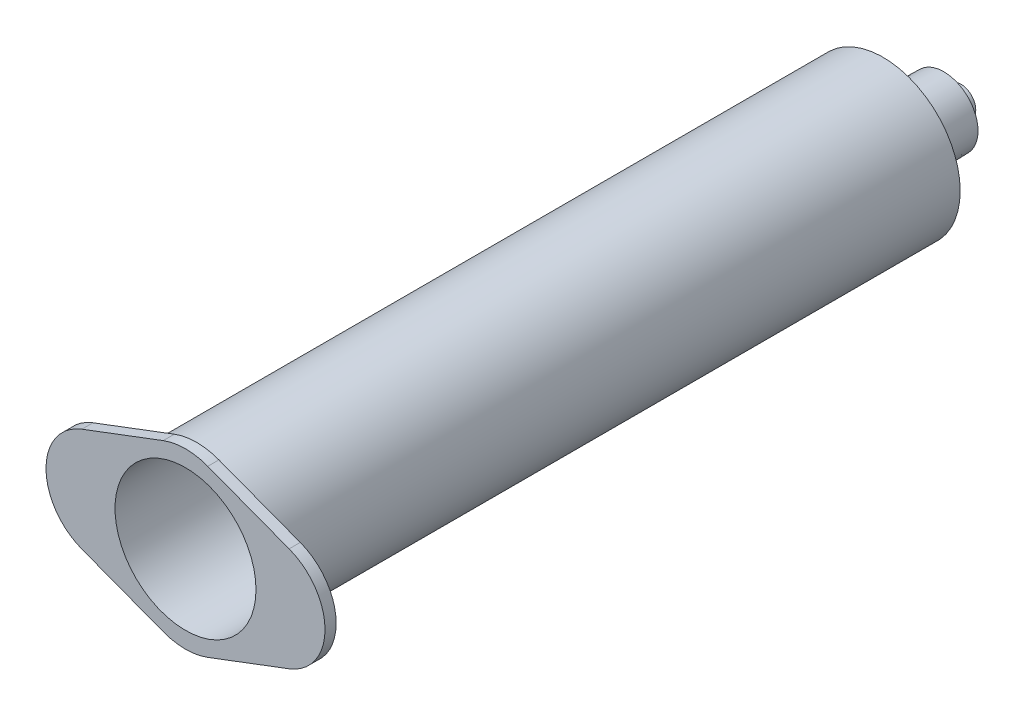
ISO-10303-21;
HEADER;
FILE_DESCRIPTION(('STEP AP214'),'2;1');
FILE_NAME('part.step','',(''),(''),'','','');
FILE_SCHEMA(('AUTOMOTIVE_DESIGN { 1 0 10303 214 1 1 1 1 }'));
ENDSEC;
DATA;
#1=APPLICATION_CONTEXT('core data for automotive mechanical design processes');
#2=APPLICATION_PROTOCOL_DEFINITION('international standard','automotive_design',2000,#1);
#3=PRODUCT_CONTEXT('',#1,'mechanical');
#4=PRODUCT('Part','Part','',(#3));
#5=PRODUCT_RELATED_PRODUCT_CATEGORY('part','',(#4));
#6=PRODUCT_DEFINITION_FORMATION('','',#4);
#7=PRODUCT_DEFINITION_CONTEXT('part definition',#1,'design');
#8=PRODUCT_DEFINITION('design','',#6,#7);
#9=PRODUCT_DEFINITION_SHAPE('','',#8);
#10=(LENGTH_UNIT() NAMED_UNIT(*) SI_UNIT(.MILLI.,.METRE.));
#11=(NAMED_UNIT(*) PLANE_ANGLE_UNIT() SI_UNIT($,.RADIAN.));
#12=(NAMED_UNIT(*) SI_UNIT($,.STERADIAN.) SOLID_ANGLE_UNIT());
#13=UNCERTAINTY_MEASURE_WITH_UNIT(LENGTH_MEASURE(1.E-05),#10,'distance_accuracy_value','');
#14=(GEOMETRIC_REPRESENTATION_CONTEXT(3) GLOBAL_UNCERTAINTY_ASSIGNED_CONTEXT((#13)) GLOBAL_UNIT_ASSIGNED_CONTEXT((#10,
#11,#12)) REPRESENTATION_CONTEXT('',''));
#15=CARTESIAN_POINT('',(0.,0.,0.));
#16=DIRECTION('',(0.,0.,1.));
#17=DIRECTION('',(1.,0.,0.));
#18=AXIS2_PLACEMENT_3D('',#15,#16,#17);
#19=CARTESIAN_POINT('',(0.,0.,92.5));
#20=DIRECTION('',(0.,0.,-1.));
#21=DIRECTION('',(-1.,0.,0.));
#22=AXIS2_PLACEMENT_3D('',#19,#20,#21);
#23=CYLINDRICAL_SURFACE('',#22,10.4);
#24=CARTESIAN_POINT('',(0.,0.,92.5));
#25=DIRECTION('',(0.,0.,1.));
#26=DIRECTION('',(1.,0.,0.));
#27=AXIS2_PLACEMENT_3D('',#24,#25,#26);
#28=CIRCLE('',#27,10.4);
#29=CARTESIAN_POINT('',(10.4,0.,92.5));
#30=VERTEX_POINT('',#29);
#31=EDGE_CURVE('E11',#30,#30,#28,.T.);
#32=ORIENTED_EDGE('',*,*,#31,.F.);
#33=EDGE_LOOP('',(#32));
#34=FACE_BOUND('',#33,.T.);
#35=CARTESIAN_POINT('',(0.,0.,0.));
#36=DIRECTION('',(0.,0.,1.));
#37=DIRECTION('',(1.,0.,0.));
#38=AXIS2_PLACEMENT_3D('',#35,#36,#37);
#39=CIRCLE('',#38,10.4);
#40=CARTESIAN_POINT('',(10.4,0.,0.));
#41=VERTEX_POINT('',#40);
#42=EDGE_CURVE('E165',#41,#41,#39,.T.);
#43=ORIENTED_EDGE('',*,*,#42,.T.);
#44=EDGE_LOOP('',(#43));
#45=FACE_BOUND('',#44,.T.);
#46=ADVANCED_FACE('F37',(#34,#45),#23,.T.);
#47=CARTESIAN_POINT('',(0.,0.,92.5));
#48=DIRECTION('',(0.,0.,-1.));
#49=DIRECTION('',(-1.,0.,0.));
#50=AXIS2_PLACEMENT_3D('',#47,#48,#49);
#51=CYLINDRICAL_SURFACE('',#50,9.5);
#52=CARTESIAN_POINT('',(0.,0.,0.));
#53=DIRECTION('',(0.,0.,1.));
#54=DIRECTION('',(1.,0.,0.));
#55=AXIS2_PLACEMENT_3D('',#52,#53,#54);
#56=CIRCLE('',#55,9.5);
#57=CARTESIAN_POINT('',(9.5,0.,0.));
#58=VERTEX_POINT('',#57);
#59=EDGE_CURVE('E45',#58,#58,#56,.T.);
#60=ORIENTED_EDGE('',*,*,#59,.F.);
#61=EDGE_LOOP('',(#60));
#62=FACE_BOUND('',#61,.T.);
#63=CARTESIAN_POINT('',(0.,0.,94.));
#64=DIRECTION('',(0.,0.,1.));
#65=DIRECTION('',(1.,0.,0.));
#66=AXIS2_PLACEMENT_3D('',#63,#64,#65);
#67=CIRCLE('',#66,9.5);
#68=CARTESIAN_POINT('',(9.5,0.,94.));
#69=VERTEX_POINT('',#68);
#70=EDGE_CURVE('E139',#69,#69,#67,.T.);
#71=ORIENTED_EDGE('',*,*,#70,.T.);
#72=EDGE_LOOP('',(#71));
#73=FACE_BOUND('',#72,.T.);
#74=ADVANCED_FACE('F199',(#62,#73),#51,.F.);
#75=CARTESIAN_POINT('',(0.,0.,0.));
#76=DIRECTION('',(0.,0.,1.));
#77=DIRECTION('',(1.,0.,0.));
#78=AXIS2_PLACEMENT_3D('',#75,#76,#77);
#79=CONICAL_SURFACE('',#78,9.5,1.35970299357215);
#80=CARTESIAN_POINT('',(0.,0.,-1.2));
#81=DIRECTION('',(0.,0.,1.));
#82=DIRECTION('',(1.,0.,0.));
#83=AXIS2_PLACEMENT_3D('',#80,#81,#82);
#84=CIRCLE('',#83,3.9);
#85=CARTESIAN_POINT('',(3.9,0.,-1.2));
#86=VERTEX_POINT('',#85);
#87=EDGE_CURVE('E192',#86,#86,#84,.T.);
#88=ORIENTED_EDGE('',*,*,#87,.F.);
#89=EDGE_LOOP('',(#88));
#90=FACE_BOUND('',#89,.T.);
#91=ORIENTED_EDGE('',*,*,#59,.T.);
#92=EDGE_LOOP('',(#91));
#93=FACE_BOUND('',#92,.T.);
#94=ADVANCED_FACE('F197',(#90,#93),#79,.F.);
#95=CARTESIAN_POINT('',(0.,0.969999999999999,-1.2));
#96=DIRECTION('',(0.,0.,-1.));
#97=DIRECTION('',(-1.,0.,0.));
#98=AXIS2_PLACEMENT_3D('',#95,#96,#97);
#99=PLANE('',#98);
#100=CARTESIAN_POINT('',(0.,0.,-1.2));
#101=DIRECTION('',(0.,0.,1.));
#102=DIRECTION('',(1.,0.,0.));
#103=AXIS2_PLACEMENT_3D('',#100,#101,#102);
#104=CIRCLE('',#103,0.969999999999999);
#105=CARTESIAN_POINT('',(0.969999999999999,0.,-1.2));
#106=VERTEX_POINT('',#105);
#107=EDGE_CURVE('E189',#106,#106,#104,.T.);
#108=ORIENTED_EDGE('',*,*,#107,.F.);
#109=EDGE_LOOP('',(#108));
#110=FACE_BOUND('',#109,.T.);
#111=ORIENTED_EDGE('',*,*,#87,.T.);
#112=EDGE_LOOP('',(#111));
#113=FACE_BOUND('',#112,.T.);
#114=ADVANCED_FACE('F290',(#110,#113),#99,.F.);
#115=CARTESIAN_POINT('',(0.,0.,0.));
#116=DIRECTION('',(0.,0.,1.));
#117=DIRECTION('',(1.,0.,0.));
#118=AXIS2_PLACEMENT_3D('',#115,#116,#117);
#119=CYLINDRICAL_SURFACE('',#118,0.969999999999999);
#120=CARTESIAN_POINT('',(0.,0.,-10.5));
#121=DIRECTION('',(0.,0.,1.));
#122=DIRECTION('',(1.,0.,0.));
#123=AXIS2_PLACEMENT_3D('',#120,#121,#122);
#124=CIRCLE('',#123,0.97);
#125=CARTESIAN_POINT('',(0.97,0.,-10.5));
#126=VERTEX_POINT('',#125);
#127=EDGE_CURVE('E186',#126,#126,#124,.T.);
#128=ORIENTED_EDGE('',*,*,#127,.F.);
#129=EDGE_LOOP('',(#128));
#130=FACE_BOUND('',#129,.T.);
#131=ORIENTED_EDGE('',*,*,#107,.T.);
#132=EDGE_LOOP('',(#131));
#133=FACE_BOUND('',#132,.T.);
#134=ADVANCED_FACE('F284',(#130,#133),#119,.F.);
#135=CARTESIAN_POINT('',(0.,2.,-10.5));
#136=DIRECTION('',(0.,0.,1.));
#137=DIRECTION('',(1.,0.,0.));
#138=AXIS2_PLACEMENT_3D('',#135,#136,#137);
#139=PLANE('',#138);
#140=CARTESIAN_POINT('',(0.,0.,-10.5));
#141=DIRECTION('',(0.,0.,1.));
#142=DIRECTION('',(1.,0.,0.));
#143=AXIS2_PLACEMENT_3D('',#140,#141,#142);
#144=CIRCLE('',#143,2.);
#145=CARTESIAN_POINT('',(2.,0.,-10.5));
#146=VERTEX_POINT('',#145);
#147=EDGE_CURVE('E183',#146,#146,#144,.T.);
#148=ORIENTED_EDGE('',*,*,#147,.F.);
#149=EDGE_LOOP('',(#148));
#150=FACE_BOUND('',#149,.T.);
#151=ORIENTED_EDGE('',*,*,#127,.T.);
#152=EDGE_LOOP('',(#151));
#153=FACE_BOUND('',#152,.T.);
#154=ADVANCED_FACE('F278',(#150,#153),#139,.F.);
#155=CARTESIAN_POINT('',(0.,0.,0.));
#156=DIRECTION('',(0.,0.,1.));
#157=DIRECTION('',(1.,0.,0.));
#158=AXIS2_PLACEMENT_3D('',#155,#156,#157);
#159=CYLINDRICAL_SURFACE('',#158,2.);
#160=CARTESIAN_POINT('',(0.,0.,-2.2));
#161=DIRECTION('',(0.,0.,1.));
#162=DIRECTION('',(1.,0.,0.));
#163=AXIS2_PLACEMENT_3D('',#160,#161,#162);
#164=CIRCLE('',#163,2.);
#165=CARTESIAN_POINT('',(2.,0.,-2.2));
#166=VERTEX_POINT('',#165);
#167=EDGE_CURVE('E180',#166,#166,#164,.T.);
#168=ORIENTED_EDGE('',*,*,#167,.F.);
#169=EDGE_LOOP('',(#168));
#170=FACE_BOUND('',#169,.T.);
#171=ORIENTED_EDGE('',*,*,#147,.T.);
#172=EDGE_LOOP('',(#171));
#173=FACE_BOUND('',#172,.T.);
#174=ADVANCED_FACE('F272',(#170,#173),#159,.T.);
#175=CARTESIAN_POINT('',(0.,3.8,-2.2));
#176=DIRECTION('',(0.,0.,1.));
#177=DIRECTION('',(1.,0.,0.));
#178=AXIS2_PLACEMENT_3D('',#175,#176,#177);
#179=PLANE('',#178);
#180=CARTESIAN_POINT('',(0.,0.,-2.2));
#181=DIRECTION('',(0.,0.,1.));
#182=DIRECTION('',(1.,0.,0.));
#183=AXIS2_PLACEMENT_3D('',#180,#181,#182);
#184=CIRCLE('',#183,3.8);
#185=CARTESIAN_POINT('',(3.8,0.,-2.2));
#186=VERTEX_POINT('',#185);
#187=EDGE_CURVE('E177',#186,#186,#184,.T.);
#188=ORIENTED_EDGE('',*,*,#187,.F.);
#189=EDGE_LOOP('',(#188));
#190=FACE_BOUND('',#189,.T.);
#191=ORIENTED_EDGE('',*,*,#167,.T.);
#192=EDGE_LOOP('',(#191));
#193=FACE_BOUND('',#192,.T.);
#194=ADVANCED_FACE('F266',(#190,#193),#179,.F.);
#195=CARTESIAN_POINT('',(0.,0.,0.));
#196=DIRECTION('',(0.,0.,1.));
#197=DIRECTION('',(1.,0.,0.));
#198=AXIS2_PLACEMENT_3D('',#195,#196,#197);
#199=CYLINDRICAL_SURFACE('',#198,3.8);
#200=CARTESIAN_POINT('',(0.,0.,-8.2));
#201=DIRECTION('',(0.,0.,1.));
#202=DIRECTION('',(1.,0.,0.));
#203=AXIS2_PLACEMENT_3D('',#200,#201,#202);
#204=CIRCLE('',#203,3.8);
#205=CARTESIAN_POINT('',(3.8,0.,-8.2));
#206=VERTEX_POINT('',#205);
#207=EDGE_CURVE('E174',#206,#206,#204,.T.);
#208=ORIENTED_EDGE('',*,*,#207,.F.);
#209=EDGE_LOOP('',(#208));
#210=FACE_BOUND('',#209,.T.);
#211=ORIENTED_EDGE('',*,*,#187,.T.);
#212=EDGE_LOOP('',(#211));
#213=FACE_BOUND('',#212,.T.);
#214=ADVANCED_FACE('F260',(#210,#213),#199,.F.);
#215=CARTESIAN_POINT('',(0.,4.6,-8.2));
#216=DIRECTION('',(0.,0.,1.));
#217=DIRECTION('',(1.,0.,0.));
#218=AXIS2_PLACEMENT_3D('',#215,#216,#217);
#219=PLANE('',#218);
#220=CARTESIAN_POINT('',(0.,0.,-8.2));
#221=DIRECTION('',(0.,0.,1.));
#222=DIRECTION('',(1.,0.,0.));
#223=AXIS2_PLACEMENT_3D('',#220,#221,#222);
#224=CIRCLE('',#223,4.6);
#225=CARTESIAN_POINT('',(4.6,0.,-8.2));
#226=VERTEX_POINT('',#225);
#227=EDGE_CURVE('E171',#226,#226,#224,.T.);
#228=ORIENTED_EDGE('',*,*,#227,.F.);
#229=EDGE_LOOP('',(#228));
#230=FACE_BOUND('',#229,.T.);
#231=ORIENTED_EDGE('',*,*,#207,.T.);
#232=EDGE_LOOP('',(#231));
#233=FACE_BOUND('',#232,.T.);
#234=ADVANCED_FACE('F254',(#230,#233),#219,.F.);
#235=CARTESIAN_POINT('',(0.,0.,-8.2));
#236=DIRECTION('',(0.,0.,1.));
#237=DIRECTION('',(1.,0.,0.));
#238=AXIS2_PLACEMENT_3D('',#235,#236,#237);
#239=CONICAL_SURFACE('',#238,4.6,0.0285636578387599);
#240=CARTESIAN_POINT('',(0.,0.,-1.2));
#241=DIRECTION('',(0.,0.,1.));
#242=DIRECTION('',(1.,0.,0.));
#243=AXIS2_PLACEMENT_3D('',#240,#241,#242);
#244=CIRCLE('',#243,4.8);
#245=CARTESIAN_POINT('',(4.8,0.,-1.2));
#246=VERTEX_POINT('',#245);
#247=EDGE_CURVE('E168',#246,#246,#244,.T.);
#248=ORIENTED_EDGE('',*,*,#247,.F.);
#249=EDGE_LOOP('',(#248));
#250=FACE_BOUND('',#249,.T.);
#251=ORIENTED_EDGE('',*,*,#227,.T.);
#252=EDGE_LOOP('',(#251));
#253=FACE_BOUND('',#252,.T.);
#254=ADVANCED_FACE('F248',(#250,#253),#239,.T.);
#255=CARTESIAN_POINT('',(0.,0.,-1.2));
#256=DIRECTION('',(0.,0.,1.));
#257=DIRECTION('',(1.,0.,0.));
#258=AXIS2_PLACEMENT_3D('',#255,#256,#257);
#259=CONICAL_SURFACE('',#258,4.8,1.35970299357215);
#260=ORIENTED_EDGE('',*,*,#42,.F.);
#261=EDGE_LOOP('',(#260));
#262=FACE_BOUND('',#261,.T.);
#263=ORIENTED_EDGE('',*,*,#247,.T.);
#264=EDGE_LOOP('',(#263));
#265=FACE_BOUND('',#264,.T.);
#266=ADVANCED_FACE('F245',(#262,#265),#259,.T.);
#267=CARTESIAN_POINT('',(-11.3151741128954,0.,94.));
#268=DIRECTION('',(0.,0.,-1.));
#269=DIRECTION('',(-1.,0.,0.));
#270=AXIS2_PLACEMENT_3D('',#267,#268,#269);
#271=PLANE('',#270);
#272=CARTESIAN_POINT('',(-11.3151741128954,0.,94.));
#273=DIRECTION('',(0.,0.,1.));
#274=DIRECTION('',(-1.,0.,0.));
#275=AXIS2_PLACEMENT_3D('',#272,#273,#274);
#276=CIRCLE('',#275,7.4848258871046);
#277=CARTESIAN_POINT('',(-13.9651964826635,7.,94.));
#278=VERTEX_POINT('',#277);
#279=CARTESIAN_POINT('',(-13.9651964826635,-7.,94.));
#280=VERTEX_POINT('',#279);
#281=EDGE_CURVE('E150',#278,#280,#276,.T.);
#282=ORIENTED_EDGE('',*,*,#281,.T.);
#283=DIRECTION('',(0.935225495633787,-0.354052640600995,0.));
#284=VECTOR('',#283,1.);
#285=CARTESIAN_POINT('',(-3.,-11.1511451382801,94.));
#286=LINE('',#285,#284);
#287=CARTESIAN_POINT('',(-3.,-11.1511451382801,94.));
#288=VERTEX_POINT('',#287);
#289=EDGE_CURVE('E97',#280,#288,#286,.T.);
#290=ORIENTED_EDGE('',*,*,#289,.T.);
#291=CARTESIAN_POINT('',(0.,-3.22668373011546,94.));
#292=DIRECTION('',(0.,0.,1.));
#293=DIRECTION('',(-1.,0.,0.));
#294=AXIS2_PLACEMENT_3D('',#291,#292,#293);
#295=CIRCLE('',#294,8.47331626988454);
#296=CARTESIAN_POINT('',(3.,-11.1511451382801,94.));
#297=VERTEX_POINT('',#296);
#298=EDGE_CURVE('E208',#288,#297,#295,.T.);
#299=ORIENTED_EDGE('',*,*,#298,.T.);
#300=DIRECTION('',(0.935225495633787,0.354052640600995,0.));
#301=VECTOR('',#300,1.);
#302=CARTESIAN_POINT('',(3.,-11.1511451382801,94.));
#303=LINE('',#302,#301);
#304=CARTESIAN_POINT('',(13.9651964826635,-7.,94.));
#305=VERTEX_POINT('',#304);
#306=EDGE_CURVE('E210',#297,#305,#303,.T.);
#307=ORIENTED_EDGE('',*,*,#306,.T.);
#308=CARTESIAN_POINT('',(11.3151741128954,0.,94.));
#309=DIRECTION('',(0.,0.,1.));
#310=DIRECTION('',(1.,0.,0.));
#311=AXIS2_PLACEMENT_3D('',#308,#309,#310);
#312=CIRCLE('',#311,7.4848258871046);
#313=CARTESIAN_POINT('',(13.9651964826635,7.,94.));
#314=VERTEX_POINT('',#313);
#315=EDGE_CURVE('E117',#305,#314,#312,.T.);
#316=ORIENTED_EDGE('',*,*,#315,.T.);
#317=DIRECTION('',(-0.935225495633787,0.354052640600996,0.));
#318=VECTOR('',#317,1.);
#319=CARTESIAN_POINT('',(3.,11.1511451382801,94.));
#320=LINE('',#319,#318);
#321=CARTESIAN_POINT('',(3.,11.1511451382801,94.));
#322=VERTEX_POINT('',#321);
#323=EDGE_CURVE('E110',#314,#322,#320,.T.);
#324=ORIENTED_EDGE('',*,*,#323,.T.);
#325=CARTESIAN_POINT('',(0.,3.22668373011546,94.));
#326=DIRECTION('',(0.,0.,1.));
#327=DIRECTION('',(1.,0.,0.));
#328=AXIS2_PLACEMENT_3D('',#325,#326,#327);
#329=CIRCLE('',#328,8.47331626988454);
#330=CARTESIAN_POINT('',(-3.,11.1511451382801,94.));
#331=VERTEX_POINT('',#330);
#332=EDGE_CURVE('E115',#322,#331,#329,.T.);
#333=ORIENTED_EDGE('',*,*,#332,.T.);
#334=DIRECTION('',(-0.935225495633787,-0.354052640600996,0.));
#335=VECTOR('',#334,1.);
#336=CARTESIAN_POINT('',(-3.,11.1511451382801,94.));
#337=LINE('',#336,#335);
#338=EDGE_CURVE('E53',#331,#278,#337,.T.);
#339=ORIENTED_EDGE('',*,*,#338,.T.);
#340=EDGE_LOOP('',(#282,#290,#299,#307,#316,#324,#333,#339));
#341=FACE_BOUND('',#340,.T.);
#342=ORIENTED_EDGE('',*,*,#70,.F.);
#343=EDGE_LOOP('',(#342));
#344=FACE_BOUND('',#343,.T.);
#345=ADVANCED_FACE('F112',(#341,#344),#271,.F.);
#346=CARTESIAN_POINT('',(-11.3151741128954,0.,92.5));
#347=DIRECTION('',(0.,0.,-1.));
#348=DIRECTION('',(-1.,0.,0.));
#349=AXIS2_PLACEMENT_3D('',#346,#347,#348);
#350=PLANE('',#349);
#351=ORIENTED_EDGE('',*,*,#31,.T.);
#352=EDGE_LOOP('',(#351));
#353=FACE_BOUND('',#352,.T.);
#354=CARTESIAN_POINT('',(-11.3151741128954,0.,92.5));
#355=DIRECTION('',(0.,0.,1.));
#356=DIRECTION('',(-1.,0.,0.));
#357=AXIS2_PLACEMENT_3D('',#354,#355,#356);
#358=CIRCLE('',#357,7.4848258871046);
#359=CARTESIAN_POINT('',(-13.9651964826635,7.,92.5));
#360=VERTEX_POINT('',#359);
#361=CARTESIAN_POINT('',(-13.9651964826635,-7.,92.5));
#362=VERTEX_POINT('',#361);
#363=EDGE_CURVE('E135',#360,#362,#358,.T.);
#364=ORIENTED_EDGE('',*,*,#363,.F.);
#365=DIRECTION('',(-0.935225495633787,-0.354052640600996,0.));
#366=VECTOR('',#365,1.);
#367=CARTESIAN_POINT('',(-3.,11.1511451382801,92.5));
#368=LINE('',#367,#366);
#369=CARTESIAN_POINT('',(-3.,11.1511451382801,92.5));
#370=VERTEX_POINT('',#369);
#371=EDGE_CURVE('E88',#370,#360,#368,.T.);
#372=ORIENTED_EDGE('',*,*,#371,.F.);
#373=CARTESIAN_POINT('',(0.,3.22668373011546,92.5));
#374=DIRECTION('',(0.,0.,1.));
#375=DIRECTION('',(1.,0.,0.));
#376=AXIS2_PLACEMENT_3D('',#373,#374,#375);
#377=CIRCLE('',#376,8.47331626988454);
#378=CARTESIAN_POINT('',(3.,11.1511451382801,92.5));
#379=VERTEX_POINT('',#378);
#380=EDGE_CURVE('E82',#379,#370,#377,.T.);
#381=ORIENTED_EDGE('',*,*,#380,.F.);
#382=DIRECTION('',(-0.935225495633787,0.354052640600996,0.));
#383=VECTOR('',#382,1.);
#384=CARTESIAN_POINT('',(3.,11.1511451382801,92.5));
#385=LINE('',#384,#383);
#386=CARTESIAN_POINT('',(13.9651964826635,7.,92.5));
#387=VERTEX_POINT('',#386);
#388=EDGE_CURVE('E125',#387,#379,#385,.T.);
#389=ORIENTED_EDGE('',*,*,#388,.F.);
#390=CARTESIAN_POINT('',(11.3151741128954,0.,92.5));
#391=DIRECTION('',(0.,0.,1.));
#392=DIRECTION('',(1.,0.,0.));
#393=AXIS2_PLACEMENT_3D('',#390,#391,#392);
#394=CIRCLE('',#393,7.4848258871046);
#395=CARTESIAN_POINT('',(13.9651964826635,-7.,92.5));
#396=VERTEX_POINT('',#395);
#397=EDGE_CURVE('E145',#396,#387,#394,.T.);
#398=ORIENTED_EDGE('',*,*,#397,.F.);
#399=DIRECTION('',(0.935225495633787,0.354052640600995,0.));
#400=VECTOR('',#399,1.);
#401=CARTESIAN_POINT('',(3.,-11.1511451382801,92.5));
#402=LINE('',#401,#400);
#403=CARTESIAN_POINT('',(3.,-11.1511451382801,92.5));
#404=VERTEX_POINT('',#403);
#405=EDGE_CURVE('E143',#404,#396,#402,.T.);
#406=ORIENTED_EDGE('',*,*,#405,.F.);
#407=CARTESIAN_POINT('',(0.,-3.22668373011546,92.5));
#408=DIRECTION('',(0.,0.,1.));
#409=DIRECTION('',(-1.,0.,0.));
#410=AXIS2_PLACEMENT_3D('',#407,#408,#409);
#411=CIRCLE('',#410,8.47331626988454);
#412=CARTESIAN_POINT('',(-3.,-11.1511451382801,92.5));
#413=VERTEX_POINT('',#412);
#414=EDGE_CURVE('E141',#413,#404,#411,.T.);
#415=ORIENTED_EDGE('',*,*,#414,.F.);
#416=DIRECTION('',(0.935225495633787,-0.354052640600995,0.));
#417=VECTOR('',#416,1.);
#418=CARTESIAN_POINT('',(-3.,-11.1511451382801,92.5));
#419=LINE('',#418,#417);
#420=EDGE_CURVE('E138',#362,#413,#419,.T.);
#421=ORIENTED_EDGE('',*,*,#420,.F.);
#422=EDGE_LOOP('',(#364,#372,#381,#389,#398,#406,#415,#421));
#423=FACE_BOUND('',#422,.T.);
#424=ADVANCED_FACE('F223',(#353,#423),#350,.T.);
#425=CARTESIAN_POINT('',(-11.3151741128954,0.,94.));
#426=DIRECTION('',(0.,0.,-1.));
#427=DIRECTION('',(-1.,0.,0.));
#428=AXIS2_PLACEMENT_3D('',#425,#426,#427);
#429=CYLINDRICAL_SURFACE('',#428,7.4848258871046);
#430=ORIENTED_EDGE('',*,*,#363,.T.);
#431=DIRECTION('',(0.,0.,-1.));
#432=VECTOR('',#431,1.);
#433=CARTESIAN_POINT('',(-13.9651964826635,-7.,94.));
#434=LINE('',#433,#432);
#435=EDGE_CURVE('E163',#280,#362,#434,.T.);
#436=ORIENTED_EDGE('',*,*,#435,.F.);
#437=ORIENTED_EDGE('',*,*,#281,.F.);
#438=DIRECTION('',(0.,0.,-1.));
#439=VECTOR('',#438,1.);
#440=CARTESIAN_POINT('',(-13.9651964826635,7.,94.));
#441=LINE('',#440,#439);
#442=EDGE_CURVE('E131',#278,#360,#441,.T.);
#443=ORIENTED_EDGE('',*,*,#442,.T.);
#444=EDGE_LOOP('',(#430,#436,#437,#443));
#445=FACE_BOUND('',#444,.T.);
#446=ADVANCED_FACE('F227',(#445),#429,.T.);
#447=CARTESIAN_POINT('',(-3.,-11.1511451382801,94.));
#448=DIRECTION('',(0.354052640600995,0.935225495633787,0.));
#449=DIRECTION('',(-0.935225495633787,0.354052640600995,0.));
#450=AXIS2_PLACEMENT_3D('',#447,#448,#449);
#451=PLANE('',#450);
#452=ORIENTED_EDGE('',*,*,#420,.T.);
#453=DIRECTION('',(0.,0.,-1.));
#454=VECTOR('',#453,1.);
#455=CARTESIAN_POINT('',(-3.,-11.1511451382801,94.));
#456=LINE('',#455,#454);
#457=EDGE_CURVE('E160',#288,#413,#456,.T.);
#458=ORIENTED_EDGE('',*,*,#457,.F.);
#459=ORIENTED_EDGE('',*,*,#289,.F.);
#460=ORIENTED_EDGE('',*,*,#435,.T.);
#461=EDGE_LOOP('',(#452,#458,#459,#460));
#462=FACE_BOUND('',#461,.T.);
#463=ADVANCED_FACE('F306',(#462),#451,.F.);
#464=CARTESIAN_POINT('',(0.,-3.22668373011546,94.));
#465=DIRECTION('',(0.,0.,-1.));
#466=DIRECTION('',(-1.,0.,0.));
#467=AXIS2_PLACEMENT_3D('',#464,#465,#466);
#468=CYLINDRICAL_SURFACE('',#467,8.47331626988454);
#469=ORIENTED_EDGE('',*,*,#414,.T.);
#470=DIRECTION('',(0.,0.,-1.));
#471=VECTOR('',#470,1.);
#472=CARTESIAN_POINT('',(3.,-11.1511451382801,94.));
#473=LINE('',#472,#471);
#474=EDGE_CURVE('E157',#297,#404,#473,.T.);
#475=ORIENTED_EDGE('',*,*,#474,.F.);
#476=ORIENTED_EDGE('',*,*,#298,.F.);
#477=ORIENTED_EDGE('',*,*,#457,.T.);
#478=EDGE_LOOP('',(#469,#475,#476,#477));
#479=FACE_BOUND('',#478,.T.);
#480=ADVANCED_FACE('F309',(#479),#468,.T.);
#481=CARTESIAN_POINT('',(3.,-11.1511451382801,94.));
#482=DIRECTION('',(-0.354052640600995,0.935225495633787,0.));
#483=DIRECTION('',(-0.935225495633787,-0.354052640600995,0.));
#484=AXIS2_PLACEMENT_3D('',#481,#482,#483);
#485=PLANE('',#484);
#486=ORIENTED_EDGE('',*,*,#405,.T.);
#487=DIRECTION('',(0.,0.,-1.));
#488=VECTOR('',#487,1.);
#489=CARTESIAN_POINT('',(13.9651964826635,-7.,94.));
#490=LINE('',#489,#488);
#491=EDGE_CURVE('E154',#305,#396,#490,.T.);
#492=ORIENTED_EDGE('',*,*,#491,.F.);
#493=ORIENTED_EDGE('',*,*,#306,.F.);
#494=ORIENTED_EDGE('',*,*,#474,.T.);
#495=EDGE_LOOP('',(#486,#492,#493,#494));
#496=FACE_BOUND('',#495,.T.);
#497=ADVANCED_FACE('F216',(#496),#485,.F.);
#498=CARTESIAN_POINT('',(11.3151741128954,0.,94.));
#499=DIRECTION('',(0.,0.,-1.));
#500=DIRECTION('',(-1.,0.,0.));
#501=AXIS2_PLACEMENT_3D('',#498,#499,#500);
#502=CYLINDRICAL_SURFACE('',#501,7.4848258871046);
#503=ORIENTED_EDGE('',*,*,#397,.T.);
#504=DIRECTION('',(0.,0.,-1.));
#505=VECTOR('',#504,1.);
#506=CARTESIAN_POINT('',(13.9651964826635,7.,94.));
#507=LINE('',#506,#505);
#508=EDGE_CURVE('E126',#314,#387,#507,.T.);
#509=ORIENTED_EDGE('',*,*,#508,.F.);
#510=ORIENTED_EDGE('',*,*,#315,.F.);
#511=ORIENTED_EDGE('',*,*,#491,.T.);
#512=EDGE_LOOP('',(#503,#509,#510,#511));
#513=FACE_BOUND('',#512,.T.);
#514=ADVANCED_FACE('F220',(#513),#502,.T.);
#515=CARTESIAN_POINT('',(3.,11.1511451382801,94.));
#516=DIRECTION('',(-0.354052640600996,-0.935225495633787,0.));
#517=DIRECTION('',(0.935225495633787,-0.354052640600996,0.));
#518=AXIS2_PLACEMENT_3D('',#515,#516,#517);
#519=PLANE('',#518);
#520=ORIENTED_EDGE('',*,*,#388,.T.);
#521=DIRECTION('',(0.,0.,-1.));
#522=VECTOR('',#521,1.);
#523=CARTESIAN_POINT('',(3.,11.1511451382801,94.));
#524=LINE('',#523,#522);
#525=EDGE_CURVE('E122',#322,#379,#524,.T.);
#526=ORIENTED_EDGE('',*,*,#525,.F.);
#527=ORIENTED_EDGE('',*,*,#323,.F.);
#528=ORIENTED_EDGE('',*,*,#508,.T.);
#529=EDGE_LOOP('',(#520,#526,#527,#528));
#530=FACE_BOUND('',#529,.T.);
#531=ADVANCED_FACE('F123',(#530),#519,.F.);
#532=CARTESIAN_POINT('',(0.,3.22668373011546,94.));
#533=DIRECTION('',(0.,0.,-1.));
#534=DIRECTION('',(-1.,0.,0.));
#535=AXIS2_PLACEMENT_3D('',#532,#533,#534);
#536=CYLINDRICAL_SURFACE('',#535,8.47331626988454);
#537=ORIENTED_EDGE('',*,*,#380,.T.);
#538=DIRECTION('',(0.,0.,-1.));
#539=VECTOR('',#538,1.);
#540=CARTESIAN_POINT('',(-3.,11.1511451382801,94.));
#541=LINE('',#540,#539);
#542=EDGE_CURVE('E127',#331,#370,#541,.T.);
#543=ORIENTED_EDGE('',*,*,#542,.F.);
#544=ORIENTED_EDGE('',*,*,#332,.F.);
#545=ORIENTED_EDGE('',*,*,#525,.T.);
#546=EDGE_LOOP('',(#537,#543,#544,#545));
#547=FACE_BOUND('',#546,.T.);
#548=ADVANCED_FACE('F129',(#547),#536,.T.);
#549=CARTESIAN_POINT('',(-3.,11.1511451382801,94.));
#550=DIRECTION('',(0.354052640600996,-0.935225495633787,0.));
#551=DIRECTION('',(0.935225495633787,0.354052640600996,0.));
#552=AXIS2_PLACEMENT_3D('',#549,#550,#551);
#553=PLANE('',#552);
#554=ORIENTED_EDGE('',*,*,#371,.T.);
#555=ORIENTED_EDGE('',*,*,#442,.F.);
#556=ORIENTED_EDGE('',*,*,#338,.F.);
#557=ORIENTED_EDGE('',*,*,#542,.T.);
#558=EDGE_LOOP('',(#554,#555,#556,#557));
#559=FACE_BOUND('',#558,.T.);
#560=ADVANCED_FACE('F229',(#559),#553,.F.);
#561=CLOSED_SHELL('',(#46,#74,#94,#114,#134,#154,#174,#194,#214,#234,#254,#266,#345,#424,#446,
#463,#480,#497,#514,#531,#548,#560));
#562=MANIFOLD_SOLID_BREP('B2',#561);
#563=ADVANCED_BREP_SHAPE_REPRESENTATION('',(#18,#562),#14);
#564=SHAPE_DEFINITION_REPRESENTATION(#9,#563);
ENDSEC;
END-ISO-10303-21;
